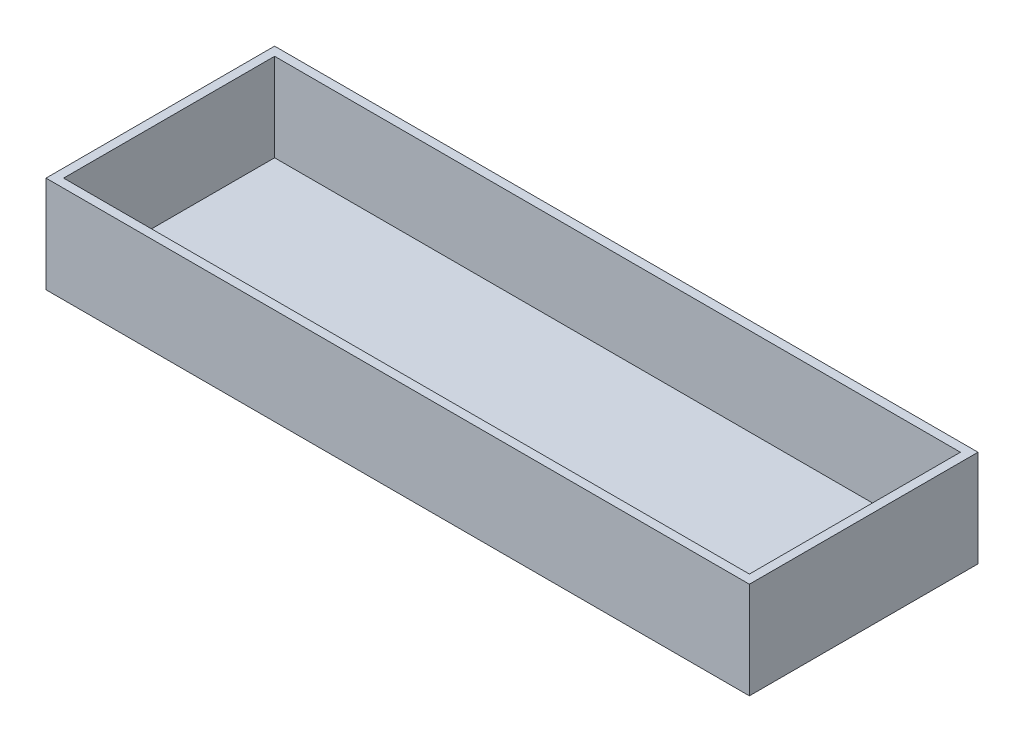
ISO-10303-21;
HEADER;
FILE_DESCRIPTION(('STEP AP214'),'2;1');
FILE_NAME('part.step','',(''),(''),'','','');
FILE_SCHEMA(('AUTOMOTIVE_DESIGN { 1 0 10303 214 1 1 1 1 }'));
ENDSEC;
DATA;
#1=APPLICATION_CONTEXT('core data for automotive mechanical design processes');
#2=APPLICATION_PROTOCOL_DEFINITION('international standard','automotive_design',2000,#1);
#3=PRODUCT_CONTEXT('',#1,'mechanical');
#4=PRODUCT('Part','Part','',(#3));
#5=PRODUCT_RELATED_PRODUCT_CATEGORY('part','',(#4));
#6=PRODUCT_DEFINITION_FORMATION('','',#4);
#7=PRODUCT_DEFINITION_CONTEXT('part definition',#1,'design');
#8=PRODUCT_DEFINITION('design','',#6,#7);
#9=PRODUCT_DEFINITION_SHAPE('','',#8);
#10=(LENGTH_UNIT() NAMED_UNIT(*) SI_UNIT(.MILLI.,.METRE.));
#11=(NAMED_UNIT(*) PLANE_ANGLE_UNIT() SI_UNIT($,.RADIAN.));
#12=(NAMED_UNIT(*) SI_UNIT($,.STERADIAN.) SOLID_ANGLE_UNIT());
#13=UNCERTAINTY_MEASURE_WITH_UNIT(LENGTH_MEASURE(1.E-05),#10,'distance_accuracy_value','');
#14=(GEOMETRIC_REPRESENTATION_CONTEXT(3) GLOBAL_UNCERTAINTY_ASSIGNED_CONTEXT((#13)) GLOBAL_UNIT_ASSIGNED_CONTEXT((#10,
#11,#12)) REPRESENTATION_CONTEXT('',''));
#15=CARTESIAN_POINT('',(0.,0.,0.));
#16=DIRECTION('',(0.,0.,1.));
#17=DIRECTION('',(1.,0.,0.));
#18=AXIS2_PLACEMENT_3D('',#15,#16,#17);
#19=CARTESIAN_POINT('',(0.,22.,0.));
#20=DIRECTION('',(0.,1.,0.));
#21=DIRECTION('',(0.,0.,1.));
#22=AXIS2_PLACEMENT_3D('',#19,#20,#21);
#23=PLANE('',#22);
#24=DIRECTION('',(1.,0.,0.));
#25=VECTOR('',#24,1.);
#26=CARTESIAN_POINT('',(0.,22.,-52.));
#27=LINE('',#26,#25);
#28=CARTESIAN_POINT('',(0.,22.,-52.));
#29=VERTEX_POINT('',#28);
#30=CARTESIAN_POINT('',(160.,22.,-52.));
#31=VERTEX_POINT('',#30);
#32=EDGE_CURVE('E170',#29,#31,#27,.T.);
#33=ORIENTED_EDGE('',*,*,#32,.F.);
#34=DIRECTION('',(0.,0.,-1.));
#35=VECTOR('',#34,1.);
#36=CARTESIAN_POINT('',(0.,22.,0.));
#37=LINE('',#36,#35);
#38=CARTESIAN_POINT('',(0.,22.,0.));
#39=VERTEX_POINT('',#38);
#40=EDGE_CURVE('E179',#39,#29,#37,.T.);
#41=ORIENTED_EDGE('',*,*,#40,.F.);
#42=DIRECTION('',(1.,0.,0.));
#43=VECTOR('',#42,1.);
#44=CARTESIAN_POINT('',(0.,22.,0.));
#45=LINE('',#44,#43);
#46=CARTESIAN_POINT('',(160.,22.,0.));
#47=VERTEX_POINT('',#46);
#48=EDGE_CURVE('E176',#39,#47,#45,.T.);
#49=ORIENTED_EDGE('',*,*,#48,.T.);
#50=DIRECTION('',(0.,0.,-1.));
#51=VECTOR('',#50,1.);
#52=CARTESIAN_POINT('',(160.,22.,0.));
#53=LINE('',#52,#51);
#54=EDGE_CURVE('E96',#47,#31,#53,.T.);
#55=ORIENTED_EDGE('',*,*,#54,.T.);
#56=EDGE_LOOP('',(#33,#41,#49,#55));
#57=FACE_BOUND('',#56,.T.);
#58=DIRECTION('',(0.,0.,-1.));
#59=VECTOR('',#58,1.);
#60=CARTESIAN_POINT('',(2.,22.,0.));
#61=LINE('',#60,#59);
#62=CARTESIAN_POINT('',(2.,22.,-2.));
#63=VERTEX_POINT('',#62);
#64=CARTESIAN_POINT('',(2.,22.,-50.));
#65=VERTEX_POINT('',#64);
#66=EDGE_CURVE('E162',#63,#65,#61,.T.);
#67=ORIENTED_EDGE('',*,*,#66,.T.);
#68=DIRECTION('',(1.,0.,0.));
#69=VECTOR('',#68,1.);
#70=CARTESIAN_POINT('',(0.,22.,-50.));
#71=LINE('',#70,#69);
#72=CARTESIAN_POINT('',(158.,22.,-50.));
#73=VERTEX_POINT('',#72);
#74=EDGE_CURVE('E126',#65,#73,#71,.T.);
#75=ORIENTED_EDGE('',*,*,#74,.T.);
#76=DIRECTION('',(0.,0.,-1.));
#77=VECTOR('',#76,1.);
#78=CARTESIAN_POINT('',(158.,22.,0.));
#79=LINE('',#78,#77);
#80=CARTESIAN_POINT('',(158.,22.,-2.));
#81=VERTEX_POINT('',#80);
#82=EDGE_CURVE('E150',#81,#73,#79,.T.);
#83=ORIENTED_EDGE('',*,*,#82,.F.);
#84=DIRECTION('',(1.,0.,0.));
#85=VECTOR('',#84,1.);
#86=CARTESIAN_POINT('',(0.,22.,-2.));
#87=LINE('',#86,#85);
#88=EDGE_CURVE('E165',#63,#81,#87,.T.);
#89=ORIENTED_EDGE('',*,*,#88,.F.);
#90=EDGE_LOOP('',(#67,#75,#83,#89));
#91=FACE_BOUND('',#90,.T.);
#92=ADVANCED_FACE('F45',(#57,#91),#23,.T.);
#93=CARTESIAN_POINT('',(0.,22.,-52.));
#94=DIRECTION('',(0.,0.,-1.));
#95=DIRECTION('',(-1.,0.,0.));
#96=AXIS2_PLACEMENT_3D('',#93,#94,#95);
#97=PLANE('',#96);
#98=DIRECTION('',(1.,0.,0.));
#99=VECTOR('',#98,1.);
#100=CARTESIAN_POINT('',(0.,0.,-52.));
#101=LINE('',#100,#99);
#102=CARTESIAN_POINT('',(0.,0.,-52.));
#103=VERTEX_POINT('',#102);
#104=CARTESIAN_POINT('',(160.,0.,-52.));
#105=VERTEX_POINT('',#104);
#106=EDGE_CURVE('E132',#103,#105,#101,.T.);
#107=ORIENTED_EDGE('',*,*,#106,.F.);
#108=DIRECTION('',(0.,-1.,0.));
#109=VECTOR('',#108,1.);
#110=CARTESIAN_POINT('',(0.,22.,-52.));
#111=LINE('',#110,#109);
#112=EDGE_CURVE('E11',#29,#103,#111,.T.);
#113=ORIENTED_EDGE('',*,*,#112,.F.);
#114=ORIENTED_EDGE('',*,*,#32,.T.);
#115=DIRECTION('',(0.,-1.,0.));
#116=VECTOR('',#115,1.);
#117=CARTESIAN_POINT('',(160.,22.,-52.));
#118=LINE('',#117,#116);
#119=EDGE_CURVE('E49',#31,#105,#118,.T.);
#120=ORIENTED_EDGE('',*,*,#119,.T.);
#121=EDGE_LOOP('',(#107,#113,#114,#120));
#122=FACE_BOUND('',#121,.T.);
#123=ADVANCED_FACE('F47',(#122),#97,.T.);
#124=CARTESIAN_POINT('',(0.,22.,0.));
#125=DIRECTION('',(-1.,0.,0.));
#126=DIRECTION('',(0.,0.,1.));
#127=AXIS2_PLACEMENT_3D('',#124,#125,#126);
#128=PLANE('',#127);
#129=DIRECTION('',(0.,0.,-1.));
#130=VECTOR('',#129,1.);
#131=CARTESIAN_POINT('',(0.,0.,0.));
#132=LINE('',#131,#130);
#133=CARTESIAN_POINT('',(0.,0.,0.));
#134=VERTEX_POINT('',#133);
#135=EDGE_CURVE('E173',#134,#103,#132,.T.);
#136=ORIENTED_EDGE('',*,*,#135,.F.);
#137=DIRECTION('',(0.,-1.,0.));
#138=VECTOR('',#137,1.);
#139=CARTESIAN_POINT('',(0.,22.,0.));
#140=LINE('',#139,#138);
#141=EDGE_CURVE('E55',#39,#134,#140,.T.);
#142=ORIENTED_EDGE('',*,*,#141,.F.);
#143=ORIENTED_EDGE('',*,*,#40,.T.);
#144=ORIENTED_EDGE('',*,*,#112,.T.);
#145=EDGE_LOOP('',(#136,#142,#143,#144));
#146=FACE_BOUND('',#145,.T.);
#147=ADVANCED_FACE('F207',(#146),#128,.T.);
#148=CARTESIAN_POINT('',(0.,22.,0.));
#149=DIRECTION('',(0.,0.,-1.));
#150=DIRECTION('',(-1.,0.,0.));
#151=AXIS2_PLACEMENT_3D('',#148,#149,#150);
#152=PLANE('',#151);
#153=DIRECTION('',(1.,0.,0.));
#154=VECTOR('',#153,1.);
#155=CARTESIAN_POINT('',(0.,0.,0.));
#156=LINE('',#155,#154);
#157=CARTESIAN_POINT('',(160.,0.,0.));
#158=VERTEX_POINT('',#157);
#159=EDGE_CURVE('E189',#134,#158,#156,.T.);
#160=ORIENTED_EDGE('',*,*,#159,.T.);
#161=DIRECTION('',(0.,-1.,0.));
#162=VECTOR('',#161,1.);
#163=CARTESIAN_POINT('',(160.,22.,0.));
#164=LINE('',#163,#162);
#165=EDGE_CURVE('E196',#47,#158,#164,.T.);
#166=ORIENTED_EDGE('',*,*,#165,.F.);
#167=ORIENTED_EDGE('',*,*,#48,.F.);
#168=ORIENTED_EDGE('',*,*,#141,.T.);
#169=EDGE_LOOP('',(#160,#166,#167,#168));
#170=FACE_BOUND('',#169,.T.);
#171=ADVANCED_FACE('F211',(#170),#152,.F.);
#172=CARTESIAN_POINT('',(160.,22.,0.));
#173=DIRECTION('',(-1.,0.,0.));
#174=DIRECTION('',(0.,0.,1.));
#175=AXIS2_PLACEMENT_3D('',#172,#173,#174);
#176=PLANE('',#175);
#177=DIRECTION('',(0.,0.,-1.));
#178=VECTOR('',#177,1.);
#179=CARTESIAN_POINT('',(160.,0.,0.));
#180=LINE('',#179,#178);
#181=EDGE_CURVE('E185',#158,#105,#180,.T.);
#182=ORIENTED_EDGE('',*,*,#181,.T.);
#183=ORIENTED_EDGE('',*,*,#119,.F.);
#184=ORIENTED_EDGE('',*,*,#54,.F.);
#185=ORIENTED_EDGE('',*,*,#165,.T.);
#186=EDGE_LOOP('',(#182,#183,#184,#185));
#187=FACE_BOUND('',#186,.T.);
#188=ADVANCED_FACE('F203',(#187),#176,.F.);
#189=CARTESIAN_POINT('',(0.,0.,0.));
#190=DIRECTION('',(0.,1.,0.));
#191=DIRECTION('',(0.,0.,1.));
#192=AXIS2_PLACEMENT_3D('',#189,#190,#191);
#193=PLANE('',#192);
#194=ORIENTED_EDGE('',*,*,#106,.T.);
#195=ORIENTED_EDGE('',*,*,#181,.F.);
#196=ORIENTED_EDGE('',*,*,#159,.F.);
#197=ORIENTED_EDGE('',*,*,#135,.T.);
#198=EDGE_LOOP('',(#194,#195,#196,#197));
#199=FACE_BOUND('',#198,.T.);
#200=ADVANCED_FACE('F206',(#199),#193,.F.);
#201=CARTESIAN_POINT('',(0.,22.,-50.));
#202=DIRECTION('',(0.,0.,-1.));
#203=DIRECTION('',(-1.,0.,0.));
#204=AXIS2_PLACEMENT_3D('',#201,#202,#203);
#205=PLANE('',#204);
#206=DIRECTION('',(1.,0.,0.));
#207=VECTOR('',#206,1.);
#208=CARTESIAN_POINT('',(0.,2.,-50.));
#209=LINE('',#208,#207);
#210=CARTESIAN_POINT('',(2.,2.,-50.));
#211=VERTEX_POINT('',#210);
#212=CARTESIAN_POINT('',(158.,2.,-50.));
#213=VERTEX_POINT('',#212);
#214=EDGE_CURVE('E124',#211,#213,#209,.T.);
#215=ORIENTED_EDGE('',*,*,#214,.T.);
#216=DIRECTION('',(0.,-1.,0.));
#217=VECTOR('',#216,1.);
#218=CARTESIAN_POINT('',(158.,22.,-50.));
#219=LINE('',#218,#217);
#220=EDGE_CURVE('E155',#73,#213,#219,.T.);
#221=ORIENTED_EDGE('',*,*,#220,.F.);
#222=ORIENTED_EDGE('',*,*,#74,.F.);
#223=DIRECTION('',(0.,-1.,0.));
#224=VECTOR('',#223,1.);
#225=CARTESIAN_POINT('',(2.,22.,-50.));
#226=LINE('',#225,#224);
#227=EDGE_CURVE('E120',#65,#211,#226,.T.);
#228=ORIENTED_EDGE('',*,*,#227,.T.);
#229=EDGE_LOOP('',(#215,#221,#222,#228));
#230=FACE_BOUND('',#229,.T.);
#231=ADVANCED_FACE('F122',(#230),#205,.F.);
#232=CARTESIAN_POINT('',(2.,22.,0.));
#233=DIRECTION('',(-1.,0.,0.));
#234=DIRECTION('',(0.,0.,1.));
#235=AXIS2_PLACEMENT_3D('',#232,#233,#234);
#236=PLANE('',#235);
#237=DIRECTION('',(0.,0.,-1.));
#238=VECTOR('',#237,1.);
#239=CARTESIAN_POINT('',(2.,2.,0.));
#240=LINE('',#239,#238);
#241=CARTESIAN_POINT('',(2.,2.,-2.));
#242=VERTEX_POINT('',#241);
#243=EDGE_CURVE('E139',#242,#211,#240,.T.);
#244=ORIENTED_EDGE('',*,*,#243,.T.);
#245=ORIENTED_EDGE('',*,*,#227,.F.);
#246=ORIENTED_EDGE('',*,*,#66,.F.);
#247=DIRECTION('',(0.,-1.,0.));
#248=VECTOR('',#247,1.);
#249=CARTESIAN_POINT('',(2.,22.,-2.));
#250=LINE('',#249,#248);
#251=EDGE_CURVE('E133',#63,#242,#250,.T.);
#252=ORIENTED_EDGE('',*,*,#251,.T.);
#253=EDGE_LOOP('',(#244,#245,#246,#252));
#254=FACE_BOUND('',#253,.T.);
#255=ADVANCED_FACE('F143',(#254),#236,.F.);
#256=CARTESIAN_POINT('',(0.,22.,-2.));
#257=DIRECTION('',(0.,0.,-1.));
#258=DIRECTION('',(-1.,0.,0.));
#259=AXIS2_PLACEMENT_3D('',#256,#257,#258);
#260=PLANE('',#259);
#261=DIRECTION('',(1.,0.,0.));
#262=VECTOR('',#261,1.);
#263=CARTESIAN_POINT('',(0.,2.,-2.));
#264=LINE('',#263,#262);
#265=CARTESIAN_POINT('',(158.,2.,-2.));
#266=VERTEX_POINT('',#265);
#267=EDGE_CURVE('E146',#242,#266,#264,.T.);
#268=ORIENTED_EDGE('',*,*,#267,.F.);
#269=ORIENTED_EDGE('',*,*,#251,.F.);
#270=ORIENTED_EDGE('',*,*,#88,.T.);
#271=DIRECTION('',(0.,-1.,0.));
#272=VECTOR('',#271,1.);
#273=CARTESIAN_POINT('',(158.,22.,-2.));
#274=LINE('',#273,#272);
#275=EDGE_CURVE('E63',#81,#266,#274,.T.);
#276=ORIENTED_EDGE('',*,*,#275,.T.);
#277=EDGE_LOOP('',(#268,#269,#270,#276));
#278=FACE_BOUND('',#277,.T.);
#279=ADVANCED_FACE('F218',(#278),#260,.T.);
#280=CARTESIAN_POINT('',(158.,22.,0.));
#281=DIRECTION('',(-1.,0.,0.));
#282=DIRECTION('',(0.,0.,1.));
#283=AXIS2_PLACEMENT_3D('',#280,#281,#282);
#284=PLANE('',#283);
#285=DIRECTION('',(0.,0.,-1.));
#286=VECTOR('',#285,1.);
#287=CARTESIAN_POINT('',(158.,2.,0.));
#288=LINE('',#287,#286);
#289=EDGE_CURVE('E140',#266,#213,#288,.T.);
#290=ORIENTED_EDGE('',*,*,#289,.F.);
#291=ORIENTED_EDGE('',*,*,#275,.F.);
#292=ORIENTED_EDGE('',*,*,#82,.T.);
#293=ORIENTED_EDGE('',*,*,#220,.T.);
#294=EDGE_LOOP('',(#290,#291,#292,#293));
#295=FACE_BOUND('',#294,.T.);
#296=ADVANCED_FACE('F219',(#295),#284,.T.);
#297=CARTESIAN_POINT('',(0.,2.,0.));
#298=DIRECTION('',(0.,1.,0.));
#299=DIRECTION('',(0.,0.,1.));
#300=AXIS2_PLACEMENT_3D('',#297,#298,#299);
#301=PLANE('',#300);
#302=ORIENTED_EDGE('',*,*,#214,.F.);
#303=ORIENTED_EDGE('',*,*,#243,.F.);
#304=ORIENTED_EDGE('',*,*,#267,.T.);
#305=ORIENTED_EDGE('',*,*,#289,.T.);
#306=EDGE_LOOP('',(#302,#303,#304,#305));
#307=FACE_BOUND('',#306,.T.);
#308=ADVANCED_FACE('F138',(#307),#301,.T.);
#309=CLOSED_SHELL('',(#92,#123,#147,#171,#188,#200,#231,#255,#279,#296,#308));
#310=MANIFOLD_SOLID_BREP('B2',#309);
#311=ADVANCED_BREP_SHAPE_REPRESENTATION('',(#18,#310),#14);
#312=SHAPE_DEFINITION_REPRESENTATION(#9,#311);
ENDSEC;
END-ISO-10303-21;
